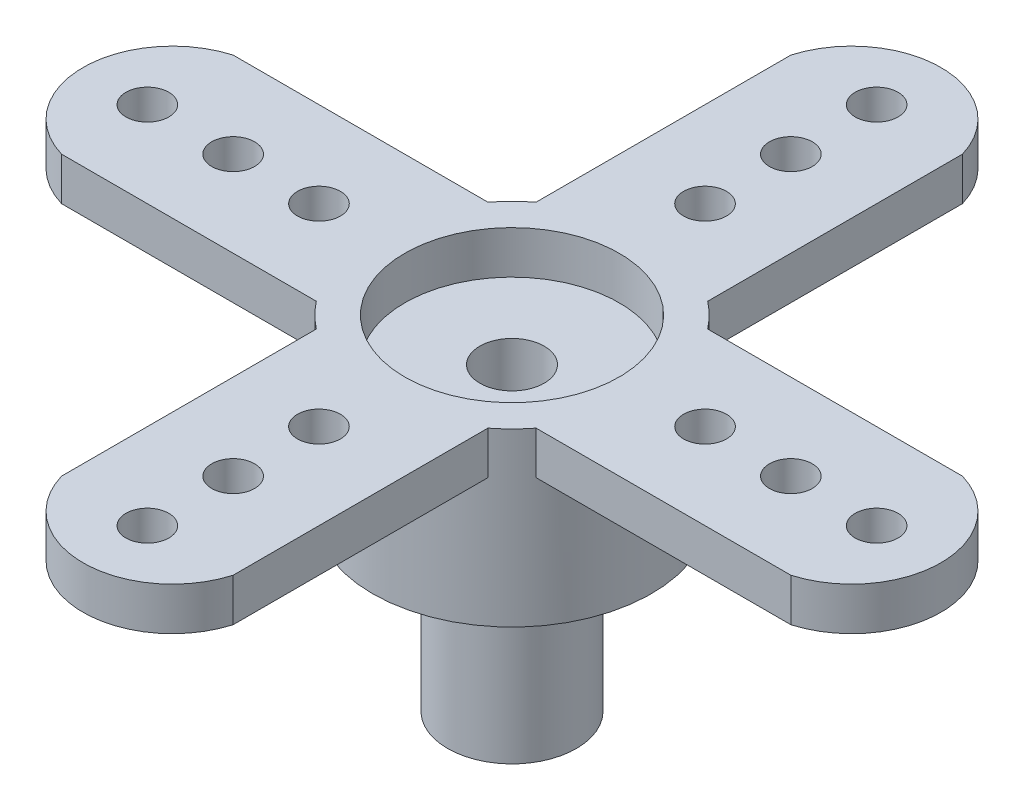
ISO-10303-21;
HEADER;
FILE_DESCRIPTION(('STEP AP214'),'2;1');
FILE_NAME('part.step','',(''),(''),'','','');
FILE_SCHEMA(('AUTOMOTIVE_DESIGN { 1 0 10303 214 1 1 1 1 }'));
ENDSEC;
DATA;
#1=APPLICATION_CONTEXT('core data for automotive mechanical design processes');
#2=APPLICATION_PROTOCOL_DEFINITION('international standard','automotive_design',2000,#1);
#3=PRODUCT_CONTEXT('',#1,'mechanical');
#4=PRODUCT('Part','Part','',(#3));
#5=PRODUCT_RELATED_PRODUCT_CATEGORY('part','',(#4));
#6=PRODUCT_DEFINITION_FORMATION('','',#4);
#7=PRODUCT_DEFINITION_CONTEXT('part definition',#1,'design');
#8=PRODUCT_DEFINITION('design','',#6,#7);
#9=PRODUCT_DEFINITION_SHAPE('','',#8);
#10=(LENGTH_UNIT() NAMED_UNIT(*) SI_UNIT(.MILLI.,.METRE.));
#11=(NAMED_UNIT(*) PLANE_ANGLE_UNIT() SI_UNIT($,.RADIAN.));
#12=(NAMED_UNIT(*) SI_UNIT($,.STERADIAN.) SOLID_ANGLE_UNIT());
#13=UNCERTAINTY_MEASURE_WITH_UNIT(LENGTH_MEASURE(1.E-05),#10,'distance_accuracy_value','');
#14=(GEOMETRIC_REPRESENTATION_CONTEXT(3) GLOBAL_UNCERTAINTY_ASSIGNED_CONTEXT((#13)) GLOBAL_UNIT_ASSIGNED_CONTEXT((#10,
#11,#12)) REPRESENTATION_CONTEXT('',''));
#15=CARTESIAN_POINT('',(0.,0.,0.));
#16=DIRECTION('',(0.,0.,1.));
#17=DIRECTION('',(1.,0.,0.));
#18=AXIS2_PLACEMENT_3D('',#15,#16,#17);
#19=CARTESIAN_POINT('',(0.,7.,4.5));
#20=DIRECTION('',(0.,1.,0.));
#21=DIRECTION('',(0.,0.,1.));
#22=AXIS2_PLACEMENT_3D('',#19,#20,#21);
#23=CYLINDRICAL_SURFACE('',#22,0.5);
#24=CARTESIAN_POINT('',(0.,7.,4.5));
#25=DIRECTION('',(0.,1.,0.));
#26=DIRECTION('',(0.,0.,1.));
#27=AXIS2_PLACEMENT_3D('',#24,#25,#26);
#28=CIRCLE('',#27,0.5);
#29=CARTESIAN_POINT('',(0.,7.,5.));
#30=VERTEX_POINT('',#29);
#31=EDGE_CURVE('E52',#30,#30,#28,.T.);
#32=ORIENTED_EDGE('',*,*,#31,.F.);
#33=EDGE_LOOP('',(#32));
#34=FACE_BOUND('',#33,.T.);
#35=CARTESIAN_POINT('',(0.,8.,4.5));
#36=DIRECTION('',(0.,1.,0.));
#37=DIRECTION('',(0.,0.,1.));
#38=AXIS2_PLACEMENT_3D('',#35,#36,#37);
#39=CIRCLE('',#38,0.5);
#40=CARTESIAN_POINT('',(0.,8.,5.));
#41=VERTEX_POINT('',#40);
#42=EDGE_CURVE('E11',#41,#41,#39,.T.);
#43=ORIENTED_EDGE('',*,*,#42,.T.);
#44=EDGE_LOOP('',(#43));
#45=FACE_BOUND('',#44,.T.);
#46=ADVANCED_FACE('F45',(#34,#45),#23,.F.);
#47=CARTESIAN_POINT('',(0.,8.,0.));
#48=DIRECTION('',(0.,-1.,0.));
#49=DIRECTION('',(0.,0.,-1.));
#50=AXIS2_PLACEMENT_3D('',#47,#48,#49);
#51=CYLINDRICAL_SURFACE('',#50,3.25);
#52=CARTESIAN_POINT('',(0.,4.,0.));
#53=DIRECTION('',(0.,1.,0.));
#54=DIRECTION('',(0.,0.,1.));
#55=AXIS2_PLACEMENT_3D('',#52,#53,#54);
#56=CIRCLE('',#55,3.25);
#57=CARTESIAN_POINT('',(0.,4.,3.25));
#58=VERTEX_POINT('',#57);
#59=EDGE_CURVE('E269',#58,#58,#56,.T.);
#60=ORIENTED_EDGE('',*,*,#59,.T.);
#61=EDGE_LOOP('',(#60));
#62=FACE_BOUND('',#61,.T.);
#63=DIRECTION('',(0.,1.,0.));
#64=VECTOR('',#63,1.);
#65=CARTESIAN_POINT('',(-2.56173769148992,7.,-1.99999999999997));
#66=LINE('',#65,#64);
#67=CARTESIAN_POINT('',(-2.56173769148992,7.,-1.99999999999997));
#68=VERTEX_POINT('',#67);
#69=CARTESIAN_POINT('',(-2.56173769148992,8.,-1.99999999999997));
#70=VERTEX_POINT('',#69);
#71=EDGE_CURVE('E194',#68,#70,#66,.T.);
#72=ORIENTED_EDGE('',*,*,#71,.T.);
#73=CARTESIAN_POINT('',(0.,8.,0.));
#74=DIRECTION('',(0.,1.,0.));
#75=DIRECTION('',(0.,0.,1.));
#76=AXIS2_PLACEMENT_3D('',#73,#74,#75);
#77=CIRCLE('',#76,3.25);
#78=CARTESIAN_POINT('',(-2.,8.,-2.5617376914899));
#79=VERTEX_POINT('',#78);
#80=EDGE_CURVE('E335',#79,#70,#77,.T.);
#81=ORIENTED_EDGE('',*,*,#80,.F.);
#82=DIRECTION('',(0.,1.,0.));
#83=VECTOR('',#82,1.);
#84=CARTESIAN_POINT('',(-2.,7.,-2.5617376914899));
#85=LINE('',#84,#83);
#86=CARTESIAN_POINT('',(-2.,7.,-2.5617376914899));
#87=VERTEX_POINT('',#86);
#88=EDGE_CURVE('E219',#87,#79,#85,.T.);
#89=ORIENTED_EDGE('',*,*,#88,.F.);
#90=CARTESIAN_POINT('',(0.,7.,0.));
#91=DIRECTION('',(0.,1.,0.));
#92=DIRECTION('',(0.,0.,-1.));
#93=AXIS2_PLACEMENT_3D('',#90,#91,#92);
#94=CIRCLE('',#93,3.25);
#95=CARTESIAN_POINT('',(2.,7.,-2.5617376914899));
#96=VERTEX_POINT('',#95);
#97=EDGE_CURVE('E205',#96,#87,#94,.T.);
#98=ORIENTED_EDGE('',*,*,#97,.F.);
#99=DIRECTION('',(0.,1.,0.));
#100=VECTOR('',#99,1.);
#101=CARTESIAN_POINT('',(2.,7.,-2.5617376914899));
#102=LINE('',#101,#100);
#103=CARTESIAN_POINT('',(2.,8.,-2.5617376914899));
#104=VERTEX_POINT('',#103);
#105=EDGE_CURVE('E216',#96,#104,#102,.T.);
#106=ORIENTED_EDGE('',*,*,#105,.T.);
#107=CARTESIAN_POINT('',(2.56173769148989,8.,-2.00000000000001));
#108=VERTEX_POINT('',#107);
#109=EDGE_CURVE('E281',#108,#104,#77,.T.);
#110=ORIENTED_EDGE('',*,*,#109,.F.);
#111=DIRECTION('',(0.,1.,0.));
#112=VECTOR('',#111,1.);
#113=CARTESIAN_POINT('',(2.56173769148989,7.,-2.00000000000001));
#114=LINE('',#113,#112);
#115=CARTESIAN_POINT('',(2.56173769148989,7.,-2.00000000000001));
#116=VERTEX_POINT('',#115);
#117=EDGE_CURVE('E245',#116,#108,#114,.T.);
#118=ORIENTED_EDGE('',*,*,#117,.F.);
#119=CARTESIAN_POINT('',(0.,7.,0.));
#120=DIRECTION('',(0.,1.,0.));
#121=DIRECTION('',(1.,0.,0.));
#122=AXIS2_PLACEMENT_3D('',#119,#120,#121);
#123=CIRCLE('',#122,3.25);
#124=CARTESIAN_POINT('',(2.56173769148991,7.,1.99999999999999));
#125=VERTEX_POINT('',#124);
#126=EDGE_CURVE('E229',#125,#116,#123,.T.);
#127=ORIENTED_EDGE('',*,*,#126,.F.);
#128=DIRECTION('',(0.,1.,0.));
#129=VECTOR('',#128,1.);
#130=CARTESIAN_POINT('',(2.56173769148991,7.,1.99999999999999));
#131=LINE('',#130,#129);
#132=CARTESIAN_POINT('',(2.56173769148991,8.,1.99999999999999));
#133=VERTEX_POINT('',#132);
#134=EDGE_CURVE('E242',#125,#133,#131,.T.);
#135=ORIENTED_EDGE('',*,*,#134,.T.);
#136=CARTESIAN_POINT('',(2.,8.,2.5617376914899));
#137=VERTEX_POINT('',#136);
#138=EDGE_CURVE('E277',#137,#133,#77,.T.);
#139=ORIENTED_EDGE('',*,*,#138,.F.);
#140=DIRECTION('',(0.,1.,0.));
#141=VECTOR('',#140,1.);
#142=CARTESIAN_POINT('',(2.,7.,2.5617376914899));
#143=LINE('',#142,#141);
#144=CARTESIAN_POINT('',(2.,7.,2.5617376914899));
#145=VERTEX_POINT('',#144);
#146=EDGE_CURVE('E273',#145,#137,#143,.T.);
#147=ORIENTED_EDGE('',*,*,#146,.F.);
#148=CARTESIAN_POINT('',(0.,7.,0.));
#149=DIRECTION('',(0.,1.,0.));
#150=DIRECTION('',(0.,0.,1.));
#151=AXIS2_PLACEMENT_3D('',#148,#149,#150);
#152=CIRCLE('',#151,3.25);
#153=CARTESIAN_POINT('',(-2.,7.,2.5617376914899));
#154=VERTEX_POINT('',#153);
#155=EDGE_CURVE('E256',#154,#145,#152,.T.);
#156=ORIENTED_EDGE('',*,*,#155,.F.);
#157=DIRECTION('',(0.,1.,0.));
#158=VECTOR('',#157,1.);
#159=CARTESIAN_POINT('',(-2.,7.,2.5617376914899));
#160=LINE('',#159,#158);
#161=CARTESIAN_POINT('',(-2.,8.,2.5617376914899));
#162=VERTEX_POINT('',#161);
#163=EDGE_CURVE('E270',#154,#162,#160,.T.);
#164=ORIENTED_EDGE('',*,*,#163,.T.);
#165=CARTESIAN_POINT('',(-2.56173769148988,8.,2.00000000000003));
#166=VERTEX_POINT('',#165);
#167=EDGE_CURVE('E282',#166,#162,#77,.T.);
#168=ORIENTED_EDGE('',*,*,#167,.F.);
#169=DIRECTION('',(0.,1.,0.));
#170=VECTOR('',#169,1.);
#171=CARTESIAN_POINT('',(-2.56173769148988,7.,2.00000000000003));
#172=LINE('',#171,#170);
#173=CARTESIAN_POINT('',(-2.56173769148988,7.,2.00000000000003));
#174=VERTEX_POINT('',#173);
#175=EDGE_CURVE('E166',#174,#166,#172,.T.);
#176=ORIENTED_EDGE('',*,*,#175,.F.);
#177=CARTESIAN_POINT('',(0.,7.,0.));
#178=DIRECTION('',(0.,1.,0.));
#179=DIRECTION('',(-1.,0.,0.));
#180=AXIS2_PLACEMENT_3D('',#177,#178,#179);
#181=CIRCLE('',#180,3.25);
#182=EDGE_CURVE('E174',#68,#174,#181,.T.);
#183=ORIENTED_EDGE('',*,*,#182,.F.);
#184=EDGE_LOOP('',(#72,#81,#89,#98,#106,#110,#118,#127,#135,#139,#147,#156,#164,#168,#176,#183));
#185=FACE_BOUND('',#184,.T.);
#186=ADVANCED_FACE('F296',(#62,#185),#51,.T.);
#187=CARTESIAN_POINT('',(0.,4.,0.));
#188=DIRECTION('',(0.,-1.,0.));
#189=DIRECTION('',(0.,0.,-1.));
#190=AXIS2_PLACEMENT_3D('',#187,#188,#189);
#191=CYLINDRICAL_SURFACE('',#190,1.5);
#192=CARTESIAN_POINT('',(0.,4.,0.));
#193=DIRECTION('',(0.,1.,0.));
#194=DIRECTION('',(0.,0.,1.));
#195=AXIS2_PLACEMENT_3D('',#192,#193,#194);
#196=CIRCLE('',#195,1.5);
#197=CARTESIAN_POINT('',(0.,4.,1.5));
#198=VERTEX_POINT('',#197);
#199=EDGE_CURVE('E285',#198,#198,#196,.T.);
#200=ORIENTED_EDGE('',*,*,#199,.F.);
#201=EDGE_LOOP('',(#200));
#202=FACE_BOUND('',#201,.T.);
#203=CARTESIAN_POINT('',(0.,0.,0.));
#204=DIRECTION('',(0.,1.,0.));
#205=DIRECTION('',(0.,0.,1.));
#206=AXIS2_PLACEMENT_3D('',#203,#204,#205);
#207=CIRCLE('',#206,1.5);
#208=CARTESIAN_POINT('',(0.,0.,1.5));
#209=VERTEX_POINT('',#208);
#210=EDGE_CURVE('E280',#209,#209,#207,.T.);
#211=ORIENTED_EDGE('',*,*,#210,.T.);
#212=EDGE_LOOP('',(#211));
#213=FACE_BOUND('',#212,.T.);
#214=ADVANCED_FACE('F312',(#202,#213),#191,.T.);
#215=CARTESIAN_POINT('',(0.,0.,0.));
#216=DIRECTION('',(0.,1.,0.));
#217=DIRECTION('',(0.,0.,1.));
#218=AXIS2_PLACEMENT_3D('',#215,#216,#217);
#219=PLANE('',#218);
#220=ORIENTED_EDGE('',*,*,#210,.F.);
#221=EDGE_LOOP('',(#220));
#222=FACE_BOUND('',#221,.T.);
#223=ADVANCED_FACE('F302',(#222),#219,.F.);
#224=CARTESIAN_POINT('',(0.,8.,0.));
#225=DIRECTION('',(0.,1.,0.));
#226=DIRECTION('',(0.,0.,1.));
#227=AXIS2_PLACEMENT_3D('',#224,#225,#226);
#228=PLANE('',#227);
#229=CARTESIAN_POINT('',(0.,8.,0.));
#230=DIRECTION('',(0.,1.,0.));
#231=DIRECTION('',(0.,0.,1.));
#232=AXIS2_PLACEMENT_3D('',#229,#230,#231);
#233=CIRCLE('',#232,2.5);
#234=CARTESIAN_POINT('',(0.,8.,2.5));
#235=VERTEX_POINT('',#234);
#236=EDGE_CURVE('E715',#235,#235,#233,.T.);
#237=ORIENTED_EDGE('',*,*,#236,.F.);
#238=EDGE_LOOP('',(#237));
#239=FACE_BOUND('',#238,.T.);
#240=CARTESIAN_POINT('',(-6.5,8.,0.));
#241=DIRECTION('',(0.,1.,0.));
#242=DIRECTION('',(-1.,0.,0.));
#243=AXIS2_PLACEMENT_3D('',#240,#241,#242);
#244=CIRCLE('',#243,0.5);
#245=CARTESIAN_POINT('',(-7.,8.,0.));
#246=VERTEX_POINT('',#245);
#247=EDGE_CURVE('E711',#246,#246,#244,.T.);
#248=ORIENTED_EDGE('',*,*,#247,.F.);
#249=EDGE_LOOP('',(#248));
#250=FACE_BOUND('',#249,.T.);
#251=CARTESIAN_POINT('',(-4.5,8.,0.));
#252=DIRECTION('',(0.,1.,0.));
#253=DIRECTION('',(-1.,0.,0.));
#254=AXIS2_PLACEMENT_3D('',#251,#252,#253);
#255=CIRCLE('',#254,0.5);
#256=CARTESIAN_POINT('',(-5.,8.,0.));
#257=VERTEX_POINT('',#256);
#258=EDGE_CURVE('E706',#257,#257,#255,.T.);
#259=ORIENTED_EDGE('',*,*,#258,.F.);
#260=EDGE_LOOP('',(#259));
#261=FACE_BOUND('',#260,.T.);
#262=CARTESIAN_POINT('',(0.,8.,-6.5));
#263=DIRECTION('',(0.,1.,0.));
#264=DIRECTION('',(0.,0.,-1.));
#265=AXIS2_PLACEMENT_3D('',#262,#263,#264);
#266=CIRCLE('',#265,0.5);
#267=CARTESIAN_POINT('',(0.,8.,-7.));
#268=VERTEX_POINT('',#267);
#269=EDGE_CURVE('E702',#268,#268,#266,.T.);
#270=ORIENTED_EDGE('',*,*,#269,.F.);
#271=EDGE_LOOP('',(#270));
#272=FACE_BOUND('',#271,.T.);
#273=CARTESIAN_POINT('',(0.,8.,-4.5));
#274=DIRECTION('',(0.,1.,0.));
#275=DIRECTION('',(0.,0.,-1.));
#276=AXIS2_PLACEMENT_3D('',#273,#274,#275);
#277=CIRCLE('',#276,0.5);
#278=CARTESIAN_POINT('',(0.,8.,-5.));
#279=VERTEX_POINT('',#278);
#280=EDGE_CURVE('E696',#279,#279,#277,.T.);
#281=ORIENTED_EDGE('',*,*,#280,.F.);
#282=EDGE_LOOP('',(#281));
#283=FACE_BOUND('',#282,.T.);
#284=CARTESIAN_POINT('',(6.5,8.,0.));
#285=DIRECTION('',(0.,1.,0.));
#286=DIRECTION('',(1.,0.,0.));
#287=AXIS2_PLACEMENT_3D('',#284,#285,#286);
#288=CIRCLE('',#287,0.5);
#289=CARTESIAN_POINT('',(7.,8.,0.));
#290=VERTEX_POINT('',#289);
#291=EDGE_CURVE('E691',#290,#290,#288,.T.);
#292=ORIENTED_EDGE('',*,*,#291,.F.);
#293=EDGE_LOOP('',(#292));
#294=FACE_BOUND('',#293,.T.);
#295=CARTESIAN_POINT('',(4.5,8.,0.));
#296=DIRECTION('',(0.,1.,0.));
#297=DIRECTION('',(1.,0.,0.));
#298=AXIS2_PLACEMENT_3D('',#295,#296,#297);
#299=CIRCLE('',#298,0.5);
#300=CARTESIAN_POINT('',(5.,8.,0.));
#301=VERTEX_POINT('',#300);
#302=EDGE_CURVE('E675',#301,#301,#299,.T.);
#303=ORIENTED_EDGE('',*,*,#302,.F.);
#304=EDGE_LOOP('',(#303));
#305=FACE_BOUND('',#304,.T.);
#306=CARTESIAN_POINT('',(8.5,8.,0.));
#307=DIRECTION('',(0.,1.,0.));
#308=DIRECTION('',(1.,0.,0.));
#309=AXIS2_PLACEMENT_3D('',#306,#307,#308);
#310=CIRCLE('',#309,0.5);
#311=CARTESIAN_POINT('',(9.,8.,0.));
#312=VERTEX_POINT('',#311);
#313=EDGE_CURVE('E668',#312,#312,#310,.T.);
#314=ORIENTED_EDGE('',*,*,#313,.F.);
#315=EDGE_LOOP('',(#314));
#316=FACE_BOUND('',#315,.T.);
#317=CARTESIAN_POINT('',(0.,8.,-8.5));
#318=DIRECTION('',(0.,1.,0.));
#319=DIRECTION('',(0.,0.,-1.));
#320=AXIS2_PLACEMENT_3D('',#317,#318,#319);
#321=CIRCLE('',#320,0.5);
#322=CARTESIAN_POINT('',(0.,8.,-9.));
#323=VERTEX_POINT('',#322);
#324=EDGE_CURVE('E639',#323,#323,#321,.T.);
#325=ORIENTED_EDGE('',*,*,#324,.F.);
#326=EDGE_LOOP('',(#325));
#327=FACE_BOUND('',#326,.T.);
#328=CARTESIAN_POINT('',(-8.5,8.,0.));
#329=DIRECTION('',(0.,1.,0.));
#330=DIRECTION('',(-1.,0.,0.));
#331=AXIS2_PLACEMENT_3D('',#328,#329,#330);
#332=CIRCLE('',#331,0.5);
#333=CARTESIAN_POINT('',(-9.,8.,0.));
#334=VERTEX_POINT('',#333);
#335=EDGE_CURVE('E640',#334,#334,#332,.T.);
#336=ORIENTED_EDGE('',*,*,#335,.F.);
#337=EDGE_LOOP('',(#336));
#338=FACE_BOUND('',#337,.T.);
#339=CARTESIAN_POINT('',(0.,8.,6.5));
#340=DIRECTION('',(0.,1.,0.));
#341=DIRECTION('',(0.,0.,1.));
#342=AXIS2_PLACEMENT_3D('',#339,#340,#341);
#343=CIRCLE('',#342,0.5);
#344=CARTESIAN_POINT('',(0.,8.,7.));
#345=VERTEX_POINT('',#344);
#346=EDGE_CURVE('E653',#345,#345,#343,.T.);
#347=ORIENTED_EDGE('',*,*,#346,.F.);
#348=EDGE_LOOP('',(#347));
#349=FACE_BOUND('',#348,.T.);
#350=CARTESIAN_POINT('',(0.,8.,8.5));
#351=DIRECTION('',(0.,1.,0.));
#352=DIRECTION('',(0.,0.,1.));
#353=AXIS2_PLACEMENT_3D('',#350,#351,#352);
#354=CIRCLE('',#353,0.5);
#355=CARTESIAN_POINT('',(0.,8.,9.));
#356=VERTEX_POINT('',#355);
#357=EDGE_CURVE('E183',#356,#356,#354,.T.);
#358=ORIENTED_EDGE('',*,*,#357,.F.);
#359=EDGE_LOOP('',(#358));
#360=FACE_BOUND('',#359,.T.);
#361=ORIENTED_EDGE('',*,*,#138,.T.);
#362=DIRECTION('',(-1.,0.,0.));
#363=VECTOR('',#362,1.);
#364=CARTESIAN_POINT('',(0.,8.,2.));
#365=LINE('',#364,#363);
#366=CARTESIAN_POINT('',(8.50000000000001,8.,1.99999999999997));
#367=VERTEX_POINT('',#366);
#368=EDGE_CURVE('E226',#367,#133,#365,.T.);
#369=ORIENTED_EDGE('',*,*,#368,.F.);
#370=CARTESIAN_POINT('',(7.91666666666666,8.,0.));
#371=DIRECTION('',(0.,1.,0.));
#372=DIRECTION('',(1.,0.,0.));
#373=AXIS2_PLACEMENT_3D('',#370,#371,#372);
#374=CIRCLE('',#373,2.08333333333333);
#375=CARTESIAN_POINT('',(8.49999999999999,8.,-2.00000000000003));
#376=VERTEX_POINT('',#375);
#377=EDGE_CURVE('E215',#367,#376,#374,.T.);
#378=ORIENTED_EDGE('',*,*,#377,.T.);
#379=DIRECTION('',(-1.,0.,0.));
#380=VECTOR('',#379,1.);
#381=CARTESIAN_POINT('',(0.,8.,-2.));
#382=LINE('',#381,#380);
#383=EDGE_CURVE('E236',#376,#108,#382,.T.);
#384=ORIENTED_EDGE('',*,*,#383,.T.);
#385=ORIENTED_EDGE('',*,*,#109,.T.);
#386=DIRECTION('',(0.,0.,1.));
#387=VECTOR('',#386,1.);
#388=CARTESIAN_POINT('',(2.,8.,0.));
#389=LINE('',#388,#387);
#390=CARTESIAN_POINT('',(2.,8.,-8.5));
#391=VERTEX_POINT('',#390);
#392=EDGE_CURVE('E202',#391,#104,#389,.T.);
#393=ORIENTED_EDGE('',*,*,#392,.F.);
#394=CARTESIAN_POINT('',(0.,8.,-7.91666666666666));
#395=DIRECTION('',(0.,1.,0.));
#396=DIRECTION('',(0.,0.,-1.));
#397=AXIS2_PLACEMENT_3D('',#394,#395,#396);
#398=CIRCLE('',#397,2.08333333333333);
#399=CARTESIAN_POINT('',(-2.,8.,-8.5));
#400=VERTEX_POINT('',#399);
#401=EDGE_CURVE('E193',#391,#400,#398,.T.);
#402=ORIENTED_EDGE('',*,*,#401,.T.);
#403=DIRECTION('',(0.,0.,1.));
#404=VECTOR('',#403,1.);
#405=CARTESIAN_POINT('',(-2.,8.,0.));
#406=LINE('',#405,#404);
#407=EDGE_CURVE('E66',#400,#79,#406,.T.);
#408=ORIENTED_EDGE('',*,*,#407,.T.);
#409=ORIENTED_EDGE('',*,*,#80,.T.);
#410=DIRECTION('',(1.,0.,0.));
#411=VECTOR('',#410,1.);
#412=CARTESIAN_POINT('',(0.,8.,-2.));
#413=LINE('',#412,#411);
#414=CARTESIAN_POINT('',(-8.50000000000002,8.,-1.99999999999991));
#415=VERTEX_POINT('',#414);
#416=EDGE_CURVE('E179',#415,#70,#413,.T.);
#417=ORIENTED_EDGE('',*,*,#416,.F.);
#418=CARTESIAN_POINT('',(-7.91666666666666,8.,0.));
#419=DIRECTION('',(0.,1.,0.));
#420=DIRECTION('',(-1.,0.,0.));
#421=AXIS2_PLACEMENT_3D('',#418,#419,#420);
#422=CIRCLE('',#421,2.08333333333333);
#423=CARTESIAN_POINT('',(-8.49999999999998,8.,2.00000000000009));
#424=VERTEX_POINT('',#423);
#425=EDGE_CURVE('E188',#415,#424,#422,.T.);
#426=ORIENTED_EDGE('',*,*,#425,.T.);
#427=DIRECTION('',(1.,0.,0.));
#428=VECTOR('',#427,1.);
#429=CARTESIAN_POINT('',(0.,8.,2.));
#430=LINE('',#429,#428);
#431=EDGE_CURVE('E59',#424,#166,#430,.T.);
#432=ORIENTED_EDGE('',*,*,#431,.T.);
#433=ORIENTED_EDGE('',*,*,#167,.T.);
#434=DIRECTION('',(0.,0.,-1.));
#435=VECTOR('',#434,1.);
#436=CARTESIAN_POINT('',(-2.,8.,0.));
#437=LINE('',#436,#435);
#438=CARTESIAN_POINT('',(-2.,8.,8.5));
#439=VERTEX_POINT('',#438);
#440=EDGE_CURVE('E253',#439,#162,#437,.T.);
#441=ORIENTED_EDGE('',*,*,#440,.F.);
#442=CARTESIAN_POINT('',(0.,8.,7.91666666666666));
#443=DIRECTION('',(0.,1.,0.));
#444=DIRECTION('',(0.,0.,1.));
#445=AXIS2_PLACEMENT_3D('',#442,#443,#444);
#446=CIRCLE('',#445,2.08333333333333);
#447=CARTESIAN_POINT('',(2.,8.,8.5));
#448=VERTEX_POINT('',#447);
#449=EDGE_CURVE('E241',#439,#448,#446,.T.);
#450=ORIENTED_EDGE('',*,*,#449,.T.);
#451=DIRECTION('',(0.,0.,-1.));
#452=VECTOR('',#451,1.);
#453=CARTESIAN_POINT('',(2.,8.,0.));
#454=LINE('',#453,#452);
#455=EDGE_CURVE('E263',#448,#137,#454,.T.);
#456=ORIENTED_EDGE('',*,*,#455,.T.);
#457=EDGE_LOOP('',(#361,#369,#378,#384,#385,#393,#402,#408,#409,#417,#426,#432,#433,#441,#450,#456));
#458=FACE_BOUND('',#457,.T.);
#459=ORIENTED_EDGE('',*,*,#42,.F.);
#460=EDGE_LOOP('',(#459));
#461=FACE_BOUND('',#460,.T.);
#462=ADVANCED_FACE('F299',(#239,#250,#261,#272,#283,#294,#305,#316,#327,#338,#349,#360,#458,
#461),#228,.T.);
#463=CARTESIAN_POINT('',(0.,4.,0.));
#464=DIRECTION('',(0.,1.,0.));
#465=DIRECTION('',(0.,0.,1.));
#466=AXIS2_PLACEMENT_3D('',#463,#464,#465);
#467=PLANE('',#466);
#468=ORIENTED_EDGE('',*,*,#199,.T.);
#469=EDGE_LOOP('',(#468));
#470=FACE_BOUND('',#469,.T.);
#471=ORIENTED_EDGE('',*,*,#59,.F.);
#472=EDGE_LOOP('',(#471));
#473=FACE_BOUND('',#472,.T.);
#474=ADVANCED_FACE('F301',(#470,#473),#467,.F.);
#475=CARTESIAN_POINT('',(0.,7.,7.91666666666666));
#476=DIRECTION('',(0.,1.,0.));
#477=DIRECTION('',(0.,0.,1.));
#478=AXIS2_PLACEMENT_3D('',#475,#476,#477);
#479=CYLINDRICAL_SURFACE('',#478,2.08333333333333);
#480=ORIENTED_EDGE('',*,*,#449,.F.);
#481=DIRECTION('',(0.,1.,0.));
#482=VECTOR('',#481,1.);
#483=CARTESIAN_POINT('',(-2.,7.,8.5));
#484=LINE('',#483,#482);
#485=CARTESIAN_POINT('',(-2.,7.,8.5));
#486=VERTEX_POINT('',#485);
#487=EDGE_CURVE('E267',#486,#439,#484,.T.);
#488=ORIENTED_EDGE('',*,*,#487,.F.);
#489=CARTESIAN_POINT('',(0.,7.,7.91666666666666));
#490=DIRECTION('',(0.,1.,0.));
#491=DIRECTION('',(0.,0.,1.));
#492=AXIS2_PLACEMENT_3D('',#489,#490,#491);
#493=CIRCLE('',#492,2.08333333333333);
#494=CARTESIAN_POINT('',(2.,7.,8.5));
#495=VERTEX_POINT('',#494);
#496=EDGE_CURVE('E249',#486,#495,#493,.T.);
#497=ORIENTED_EDGE('',*,*,#496,.T.);
#498=DIRECTION('',(0.,1.,0.));
#499=VECTOR('',#498,1.);
#500=CARTESIAN_POINT('',(2.,7.,8.5));
#501=LINE('',#500,#499);
#502=EDGE_CURVE('E260',#495,#448,#501,.T.);
#503=ORIENTED_EDGE('',*,*,#502,.T.);
#504=EDGE_LOOP('',(#480,#488,#497,#503));
#505=FACE_BOUND('',#504,.T.);
#506=ADVANCED_FACE('F309',(#505),#479,.T.);
#507=CARTESIAN_POINT('',(-2.,7.,0.));
#508=DIRECTION('',(1.,0.,0.));
#509=DIRECTION('',(0.,0.,-1.));
#510=AXIS2_PLACEMENT_3D('',#507,#508,#509);
#511=PLANE('',#510);
#512=ORIENTED_EDGE('',*,*,#440,.T.);
#513=ORIENTED_EDGE('',*,*,#163,.F.);
#514=DIRECTION('',(0.,0.,-1.));
#515=VECTOR('',#514,1.);
#516=CARTESIAN_POINT('',(-2.,7.,0.));
#517=LINE('',#516,#515);
#518=EDGE_CURVE('E258',#486,#154,#517,.T.);
#519=ORIENTED_EDGE('',*,*,#518,.F.);
#520=ORIENTED_EDGE('',*,*,#487,.T.);
#521=EDGE_LOOP('',(#512,#513,#519,#520));
#522=FACE_BOUND('',#521,.T.);
#523=ADVANCED_FACE('F344',(#522),#511,.F.);
#524=CARTESIAN_POINT('',(2.,7.,0.));
#525=DIRECTION('',(1.,0.,0.));
#526=DIRECTION('',(0.,0.,-1.));
#527=AXIS2_PLACEMENT_3D('',#524,#525,#526);
#528=PLANE('',#527);
#529=ORIENTED_EDGE('',*,*,#455,.F.);
#530=ORIENTED_EDGE('',*,*,#502,.F.);
#531=DIRECTION('',(0.,0.,-1.));
#532=VECTOR('',#531,1.);
#533=CARTESIAN_POINT('',(2.,7.,0.));
#534=LINE('',#533,#532);
#535=EDGE_CURVE('E252',#495,#145,#534,.T.);
#536=ORIENTED_EDGE('',*,*,#535,.T.);
#537=ORIENTED_EDGE('',*,*,#146,.T.);
#538=EDGE_LOOP('',(#529,#530,#536,#537));
#539=FACE_BOUND('',#538,.T.);
#540=ADVANCED_FACE('F354',(#539),#528,.T.);
#541=CARTESIAN_POINT('',(0.,7.,0.));
#542=DIRECTION('',(0.,1.,0.));
#543=DIRECTION('',(0.,0.,1.));
#544=AXIS2_PLACEMENT_3D('',#541,#542,#543);
#545=PLANE('',#544);
#546=CARTESIAN_POINT('',(0.,7.,6.5));
#547=DIRECTION('',(0.,1.,0.));
#548=DIRECTION('',(0.,0.,1.));
#549=AXIS2_PLACEMENT_3D('',#546,#547,#548);
#550=CIRCLE('',#549,0.5);
#551=CARTESIAN_POINT('',(0.,7.,7.));
#552=VERTEX_POINT('',#551);
#553=EDGE_CURVE('E650',#552,#552,#550,.T.);
#554=ORIENTED_EDGE('',*,*,#553,.T.);
#555=EDGE_LOOP('',(#554));
#556=FACE_BOUND('',#555,.T.);
#557=CARTESIAN_POINT('',(0.,7.,8.5));
#558=DIRECTION('',(0.,1.,0.));
#559=DIRECTION('',(0.,0.,1.));
#560=AXIS2_PLACEMENT_3D('',#557,#558,#559);
#561=CIRCLE('',#560,0.5);
#562=CARTESIAN_POINT('',(0.,7.,9.));
#563=VERTEX_POINT('',#562);
#564=EDGE_CURVE('E190',#563,#563,#561,.T.);
#565=ORIENTED_EDGE('',*,*,#564,.T.);
#566=EDGE_LOOP('',(#565));
#567=FACE_BOUND('',#566,.T.);
#568=ORIENTED_EDGE('',*,*,#496,.F.);
#569=ORIENTED_EDGE('',*,*,#518,.T.);
#570=ORIENTED_EDGE('',*,*,#155,.T.);
#571=ORIENTED_EDGE('',*,*,#535,.F.);
#572=EDGE_LOOP('',(#568,#569,#570,#571));
#573=FACE_BOUND('',#572,.T.);
#574=ORIENTED_EDGE('',*,*,#31,.T.);
#575=EDGE_LOOP('',(#574));
#576=FACE_BOUND('',#575,.T.);
#577=ADVANCED_FACE('F292',(#556,#567,#573,#576),#545,.F.);
#578=CARTESIAN_POINT('',(7.91666666666666,7.,0.));
#579=DIRECTION('',(0.,1.,0.));
#580=DIRECTION('',(0.,0.,1.));
#581=AXIS2_PLACEMENT_3D('',#578,#579,#580);
#582=CYLINDRICAL_SURFACE('',#581,2.08333333333333);
#583=ORIENTED_EDGE('',*,*,#377,.F.);
#584=DIRECTION('',(0.,1.,0.));
#585=VECTOR('',#584,1.);
#586=CARTESIAN_POINT('',(8.50000000000001,7.,1.99999999999997));
#587=LINE('',#586,#585);
#588=CARTESIAN_POINT('',(8.50000000000001,7.,1.99999999999997));
#589=VERTEX_POINT('',#588);
#590=EDGE_CURVE('E239',#589,#367,#587,.T.);
#591=ORIENTED_EDGE('',*,*,#590,.F.);
#592=CARTESIAN_POINT('',(7.91666666666666,7.,0.));
#593=DIRECTION('',(0.,1.,0.));
#594=DIRECTION('',(1.,0.,0.));
#595=AXIS2_PLACEMENT_3D('',#592,#593,#594);
#596=CIRCLE('',#595,2.08333333333333);
#597=CARTESIAN_POINT('',(8.49999999999999,7.,-2.00000000000003));
#598=VERTEX_POINT('',#597);
#599=EDGE_CURVE('E222',#589,#598,#596,.T.);
#600=ORIENTED_EDGE('',*,*,#599,.T.);
#601=DIRECTION('',(0.,1.,0.));
#602=VECTOR('',#601,1.);
#603=CARTESIAN_POINT('',(8.49999999999999,7.,-2.00000000000003));
#604=LINE('',#603,#602);
#605=EDGE_CURVE('E233',#598,#376,#604,.T.);
#606=ORIENTED_EDGE('',*,*,#605,.T.);
#607=EDGE_LOOP('',(#583,#591,#600,#606));
#608=FACE_BOUND('',#607,.T.);
#609=ADVANCED_FACE('F366',(#608),#582,.T.);
#610=CARTESIAN_POINT('',(0.,7.,2.));
#611=DIRECTION('',(0.,0.,-1.));
#612=DIRECTION('',(-1.,0.,0.));
#613=AXIS2_PLACEMENT_3D('',#610,#611,#612);
#614=PLANE('',#613);
#615=ORIENTED_EDGE('',*,*,#368,.T.);
#616=ORIENTED_EDGE('',*,*,#134,.F.);
#617=DIRECTION('',(-1.,0.,0.));
#618=VECTOR('',#617,1.);
#619=CARTESIAN_POINT('',(0.,7.,2.));
#620=LINE('',#619,#618);
#621=EDGE_CURVE('E231',#589,#125,#620,.T.);
#622=ORIENTED_EDGE('',*,*,#621,.F.);
#623=ORIENTED_EDGE('',*,*,#590,.T.);
#624=EDGE_LOOP('',(#615,#616,#622,#623));
#625=FACE_BOUND('',#624,.T.);
#626=ADVANCED_FACE('F363',(#625),#614,.F.);
#627=CARTESIAN_POINT('',(0.,7.,-2.));
#628=DIRECTION('',(0.,0.,-1.));
#629=DIRECTION('',(-1.,0.,0.));
#630=AXIS2_PLACEMENT_3D('',#627,#628,#629);
#631=PLANE('',#630);
#632=ORIENTED_EDGE('',*,*,#383,.F.);
#633=ORIENTED_EDGE('',*,*,#605,.F.);
#634=DIRECTION('',(-1.,0.,0.));
#635=VECTOR('',#634,1.);
#636=CARTESIAN_POINT('',(0.,7.,-2.));
#637=LINE('',#636,#635);
#638=EDGE_CURVE('E225',#598,#116,#637,.T.);
#639=ORIENTED_EDGE('',*,*,#638,.T.);
#640=ORIENTED_EDGE('',*,*,#117,.T.);
#641=EDGE_LOOP('',(#632,#633,#639,#640));
#642=FACE_BOUND('',#641,.T.);
#643=ADVANCED_FACE('F371',(#642),#631,.T.);
#644=CARTESIAN_POINT('',(0.,7.,0.));
#645=DIRECTION('',(0.,1.,0.));
#646=DIRECTION('',(1.,0.,0.));
#647=AXIS2_PLACEMENT_3D('',#644,#645,#646);
#648=PLANE('',#647);
#649=CARTESIAN_POINT('',(6.5,7.,0.));
#650=DIRECTION('',(0.,1.,0.));
#651=DIRECTION('',(1.,0.,0.));
#652=AXIS2_PLACEMENT_3D('',#649,#650,#651);
#653=CIRCLE('',#652,0.5);
#654=CARTESIAN_POINT('',(7.,7.,0.));
#655=VERTEX_POINT('',#654);
#656=EDGE_CURVE('E646',#655,#655,#653,.T.);
#657=ORIENTED_EDGE('',*,*,#656,.T.);
#658=EDGE_LOOP('',(#657));
#659=FACE_BOUND('',#658,.T.);
#660=CARTESIAN_POINT('',(4.5,7.,0.));
#661=DIRECTION('',(0.,1.,0.));
#662=DIRECTION('',(1.,0.,0.));
#663=AXIS2_PLACEMENT_3D('',#660,#661,#662);
#664=CIRCLE('',#663,0.5);
#665=CARTESIAN_POINT('',(5.,7.,0.));
#666=VERTEX_POINT('',#665);
#667=EDGE_CURVE('E687',#666,#666,#664,.T.);
#668=ORIENTED_EDGE('',*,*,#667,.T.);
#669=EDGE_LOOP('',(#668));
#670=FACE_BOUND('',#669,.T.);
#671=CARTESIAN_POINT('',(8.5,7.,0.));
#672=DIRECTION('',(0.,1.,0.));
#673=DIRECTION('',(1.,0.,0.));
#674=AXIS2_PLACEMENT_3D('',#671,#672,#673);
#675=CIRCLE('',#674,0.5);
#676=CARTESIAN_POINT('',(9.,7.,0.));
#677=VERTEX_POINT('',#676);
#678=EDGE_CURVE('E654',#677,#677,#675,.T.);
#679=ORIENTED_EDGE('',*,*,#678,.T.);
#680=EDGE_LOOP('',(#679));
#681=FACE_BOUND('',#680,.T.);
#682=ORIENTED_EDGE('',*,*,#599,.F.);
#683=ORIENTED_EDGE('',*,*,#621,.T.);
#684=ORIENTED_EDGE('',*,*,#126,.T.);
#685=ORIENTED_EDGE('',*,*,#638,.F.);
#686=EDGE_LOOP('',(#682,#683,#684,#685));
#687=FACE_BOUND('',#686,.T.);
#688=ADVANCED_FACE('F405',(#659,#670,#681,#687),#648,.F.);
#689=CARTESIAN_POINT('',(0.,7.,-7.91666666666666));
#690=DIRECTION('',(0.,1.,0.));
#691=DIRECTION('',(0.,0.,1.));
#692=AXIS2_PLACEMENT_3D('',#689,#690,#691);
#693=CYLINDRICAL_SURFACE('',#692,2.08333333333333);
#694=ORIENTED_EDGE('',*,*,#401,.F.);
#695=DIRECTION('',(0.,1.,0.));
#696=VECTOR('',#695,1.);
#697=CARTESIAN_POINT('',(2.,7.,-8.5));
#698=LINE('',#697,#696);
#699=CARTESIAN_POINT('',(2.,7.,-8.5));
#700=VERTEX_POINT('',#699);
#701=EDGE_CURVE('E213',#700,#391,#698,.T.);
#702=ORIENTED_EDGE('',*,*,#701,.F.);
#703=CARTESIAN_POINT('',(0.,7.,-7.91666666666666));
#704=DIRECTION('',(0.,1.,0.));
#705=DIRECTION('',(0.,0.,-1.));
#706=AXIS2_PLACEMENT_3D('',#703,#704,#705);
#707=CIRCLE('',#706,2.08333333333333);
#708=CARTESIAN_POINT('',(-2.,7.,-8.5));
#709=VERTEX_POINT('',#708);
#710=EDGE_CURVE('E198',#700,#709,#707,.T.);
#711=ORIENTED_EDGE('',*,*,#710,.T.);
#712=DIRECTION('',(0.,1.,0.));
#713=VECTOR('',#712,1.);
#714=CARTESIAN_POINT('',(-2.,7.,-8.5));
#715=LINE('',#714,#713);
#716=EDGE_CURVE('E209',#709,#400,#715,.T.);
#717=ORIENTED_EDGE('',*,*,#716,.T.);
#718=EDGE_LOOP('',(#694,#702,#711,#717));
#719=FACE_BOUND('',#718,.T.);
#720=ADVANCED_FACE('F381',(#719),#693,.T.);
#721=CARTESIAN_POINT('',(2.,7.,0.));
#722=DIRECTION('',(-1.,0.,0.));
#723=DIRECTION('',(0.,0.,1.));
#724=AXIS2_PLACEMENT_3D('',#721,#722,#723);
#725=PLANE('',#724);
#726=ORIENTED_EDGE('',*,*,#392,.T.);
#727=ORIENTED_EDGE('',*,*,#105,.F.);
#728=DIRECTION('',(0.,0.,1.));
#729=VECTOR('',#728,1.);
#730=CARTESIAN_POINT('',(2.,7.,0.));
#731=LINE('',#730,#729);
#732=EDGE_CURVE('E207',#700,#96,#731,.T.);
#733=ORIENTED_EDGE('',*,*,#732,.F.);
#734=ORIENTED_EDGE('',*,*,#701,.T.);
#735=EDGE_LOOP('',(#726,#727,#733,#734));
#736=FACE_BOUND('',#735,.T.);
#737=ADVANCED_FACE('F377',(#736),#725,.F.);
#738=CARTESIAN_POINT('',(-2.,7.,0.));
#739=DIRECTION('',(-1.,0.,0.));
#740=DIRECTION('',(0.,0.,1.));
#741=AXIS2_PLACEMENT_3D('',#738,#739,#740);
#742=PLANE('',#741);
#743=ORIENTED_EDGE('',*,*,#407,.F.);
#744=ORIENTED_EDGE('',*,*,#716,.F.);
#745=DIRECTION('',(0.,0.,1.));
#746=VECTOR('',#745,1.);
#747=CARTESIAN_POINT('',(-2.,7.,0.));
#748=LINE('',#747,#746);
#749=EDGE_CURVE('E201',#709,#87,#748,.T.);
#750=ORIENTED_EDGE('',*,*,#749,.T.);
#751=ORIENTED_EDGE('',*,*,#88,.T.);
#752=EDGE_LOOP('',(#743,#744,#750,#751));
#753=FACE_BOUND('',#752,.T.);
#754=ADVANCED_FACE('F384',(#753),#742,.T.);
#755=CARTESIAN_POINT('',(0.,7.,0.));
#756=DIRECTION('',(0.,1.,0.));
#757=DIRECTION('',(0.,0.,-1.));
#758=AXIS2_PLACEMENT_3D('',#755,#756,#757);
#759=PLANE('',#758);
#760=CARTESIAN_POINT('',(0.,7.,-6.5));
#761=DIRECTION('',(0.,1.,0.));
#762=DIRECTION('',(0.,0.,-1.));
#763=AXIS2_PLACEMENT_3D('',#760,#761,#762);
#764=CIRCLE('',#763,0.5);
#765=CARTESIAN_POINT('',(0.,7.,-7.));
#766=VERTEX_POINT('',#765);
#767=EDGE_CURVE('E688',#766,#766,#764,.T.);
#768=ORIENTED_EDGE('',*,*,#767,.T.);
#769=EDGE_LOOP('',(#768));
#770=FACE_BOUND('',#769,.T.);
#771=CARTESIAN_POINT('',(0.,7.,-4.5));
#772=DIRECTION('',(0.,1.,0.));
#773=DIRECTION('',(0.,0.,-1.));
#774=AXIS2_PLACEMENT_3D('',#771,#772,#773);
#775=CIRCLE('',#774,0.5);
#776=CARTESIAN_POINT('',(0.,7.,-5.));
#777=VERTEX_POINT('',#776);
#778=EDGE_CURVE('E699',#777,#777,#775,.T.);
#779=ORIENTED_EDGE('',*,*,#778,.T.);
#780=EDGE_LOOP('',(#779));
#781=FACE_BOUND('',#780,.T.);
#782=CARTESIAN_POINT('',(0.,7.,-8.5));
#783=DIRECTION('',(0.,1.,0.));
#784=DIRECTION('',(0.,0.,-1.));
#785=AXIS2_PLACEMENT_3D('',#782,#783,#784);
#786=CIRCLE('',#785,0.5);
#787=CARTESIAN_POINT('',(0.,7.,-9.));
#788=VERTEX_POINT('',#787);
#789=EDGE_CURVE('E643',#788,#788,#786,.T.);
#790=ORIENTED_EDGE('',*,*,#789,.T.);
#791=EDGE_LOOP('',(#790));
#792=FACE_BOUND('',#791,.T.);
#793=ORIENTED_EDGE('',*,*,#710,.F.);
#794=ORIENTED_EDGE('',*,*,#732,.T.);
#795=ORIENTED_EDGE('',*,*,#97,.T.);
#796=ORIENTED_EDGE('',*,*,#749,.F.);
#797=EDGE_LOOP('',(#793,#794,#795,#796));
#798=FACE_BOUND('',#797,.T.);
#799=ADVANCED_FACE('F386',(#770,#781,#792,#798),#759,.F.);
#800=CARTESIAN_POINT('',(-7.91666666666666,7.,0.));
#801=DIRECTION('',(0.,1.,0.));
#802=DIRECTION('',(0.,0.,1.));
#803=AXIS2_PLACEMENT_3D('',#800,#801,#802);
#804=CYLINDRICAL_SURFACE('',#803,2.08333333333333);
#805=ORIENTED_EDGE('',*,*,#425,.F.);
#806=DIRECTION('',(0.,1.,0.));
#807=VECTOR('',#806,1.);
#808=CARTESIAN_POINT('',(-8.50000000000002,7.,-1.99999999999991));
#809=LINE('',#808,#807);
#810=CARTESIAN_POINT('',(-8.50000000000002,7.,-1.99999999999991));
#811=VERTEX_POINT('',#810);
#812=EDGE_CURVE('E177',#811,#415,#809,.T.);
#813=ORIENTED_EDGE('',*,*,#812,.F.);
#814=CARTESIAN_POINT('',(-7.91666666666666,7.,0.));
#815=DIRECTION('',(0.,1.,0.));
#816=DIRECTION('',(-1.,0.,0.));
#817=AXIS2_PLACEMENT_3D('',#814,#815,#816);
#818=CIRCLE('',#817,2.08333333333333);
#819=CARTESIAN_POINT('',(-8.49999999999998,7.,2.00000000000009));
#820=VERTEX_POINT('',#819);
#821=EDGE_CURVE('E172',#811,#820,#818,.T.);
#822=ORIENTED_EDGE('',*,*,#821,.T.);
#823=DIRECTION('',(0.,1.,0.));
#824=VECTOR('',#823,1.);
#825=CARTESIAN_POINT('',(-8.49999999999998,7.,2.00000000000009));
#826=LINE('',#825,#824);
#827=EDGE_CURVE('E158',#820,#424,#826,.T.);
#828=ORIENTED_EDGE('',*,*,#827,.T.);
#829=EDGE_LOOP('',(#805,#813,#822,#828));
#830=FACE_BOUND('',#829,.T.);
#831=ADVANCED_FACE('F176',(#830),#804,.T.);
#832=CARTESIAN_POINT('',(0.,7.,-2.));
#833=DIRECTION('',(0.,0.,1.));
#834=DIRECTION('',(1.,0.,0.));
#835=AXIS2_PLACEMENT_3D('',#832,#833,#834);
#836=PLANE('',#835);
#837=ORIENTED_EDGE('',*,*,#416,.T.);
#838=ORIENTED_EDGE('',*,*,#71,.F.);
#839=DIRECTION('',(1.,0.,0.));
#840=VECTOR('',#839,1.);
#841=CARTESIAN_POINT('',(0.,7.,-2.));
#842=LINE('',#841,#840);
#843=EDGE_CURVE('E167',#811,#68,#842,.T.);
#844=ORIENTED_EDGE('',*,*,#843,.F.);
#845=ORIENTED_EDGE('',*,*,#812,.T.);
#846=EDGE_LOOP('',(#837,#838,#844,#845));
#847=FACE_BOUND('',#846,.T.);
#848=ADVANCED_FACE('F394',(#847),#836,.F.);
#849=CARTESIAN_POINT('',(0.,7.,2.));
#850=DIRECTION('',(0.,0.,1.));
#851=DIRECTION('',(1.,0.,0.));
#852=AXIS2_PLACEMENT_3D('',#849,#850,#851);
#853=PLANE('',#852);
#854=ORIENTED_EDGE('',*,*,#431,.F.);
#855=ORIENTED_EDGE('',*,*,#827,.F.);
#856=DIRECTION('',(1.,0.,0.));
#857=VECTOR('',#856,1.);
#858=CARTESIAN_POINT('',(0.,7.,2.));
#859=LINE('',#858,#857);
#860=EDGE_CURVE('E161',#820,#174,#859,.T.);
#861=ORIENTED_EDGE('',*,*,#860,.T.);
#862=ORIENTED_EDGE('',*,*,#175,.T.);
#863=EDGE_LOOP('',(#854,#855,#861,#862));
#864=FACE_BOUND('',#863,.T.);
#865=ADVANCED_FACE('F160',(#864),#853,.T.);
#866=CARTESIAN_POINT('',(0.,7.,0.));
#867=DIRECTION('',(0.,1.,0.));
#868=DIRECTION('',(-1.,0.,0.));
#869=AXIS2_PLACEMENT_3D('',#866,#867,#868);
#870=PLANE('',#869);
#871=CARTESIAN_POINT('',(-6.5,7.,0.));
#872=DIRECTION('',(0.,1.,0.));
#873=DIRECTION('',(-1.,0.,0.));
#874=AXIS2_PLACEMENT_3D('',#871,#872,#873);
#875=CIRCLE('',#874,0.5);
#876=CARTESIAN_POINT('',(-7.,7.,0.));
#877=VERTEX_POINT('',#876);
#878=EDGE_CURVE('E631',#877,#877,#875,.T.);
#879=ORIENTED_EDGE('',*,*,#878,.T.);
#880=EDGE_LOOP('',(#879));
#881=FACE_BOUND('',#880,.T.);
#882=CARTESIAN_POINT('',(-4.5,7.,0.));
#883=DIRECTION('',(0.,1.,0.));
#884=DIRECTION('',(-1.,0.,0.));
#885=AXIS2_PLACEMENT_3D('',#882,#883,#884);
#886=CIRCLE('',#885,0.5);
#887=CARTESIAN_POINT('',(-5.,7.,0.));
#888=VERTEX_POINT('',#887);
#889=EDGE_CURVE('E635',#888,#888,#886,.T.);
#890=ORIENTED_EDGE('',*,*,#889,.T.);
#891=EDGE_LOOP('',(#890));
#892=FACE_BOUND('',#891,.T.);
#893=CARTESIAN_POINT('',(-8.5,7.,0.));
#894=DIRECTION('',(0.,1.,0.));
#895=DIRECTION('',(-1.,0.,0.));
#896=AXIS2_PLACEMENT_3D('',#893,#894,#895);
#897=CIRCLE('',#896,0.5);
#898=CARTESIAN_POINT('',(-9.,7.,0.));
#899=VERTEX_POINT('',#898);
#900=EDGE_CURVE('E638',#899,#899,#897,.T.);
#901=ORIENTED_EDGE('',*,*,#900,.T.);
#902=EDGE_LOOP('',(#901));
#903=FACE_BOUND('',#902,.T.);
#904=ORIENTED_EDGE('',*,*,#821,.F.);
#905=ORIENTED_EDGE('',*,*,#843,.T.);
#906=ORIENTED_EDGE('',*,*,#182,.T.);
#907=ORIENTED_EDGE('',*,*,#860,.F.);
#908=EDGE_LOOP('',(#904,#905,#906,#907));
#909=FACE_BOUND('',#908,.T.);
#910=ADVANCED_FACE('F171',(#881,#892,#903,#909),#870,.F.);
#911=CARTESIAN_POINT('',(0.,7.,8.5));
#912=DIRECTION('',(0.,1.,0.));
#913=DIRECTION('',(0.,0.,1.));
#914=AXIS2_PLACEMENT_3D('',#911,#912,#913);
#915=CYLINDRICAL_SURFACE('',#914,0.5);
#916=ORIENTED_EDGE('',*,*,#564,.F.);
#917=EDGE_LOOP('',(#916));
#918=FACE_BOUND('',#917,.T.);
#919=ORIENTED_EDGE('',*,*,#357,.T.);
#920=EDGE_LOOP('',(#919));
#921=FACE_BOUND('',#920,.T.);
#922=ADVANCED_FACE('F489',(#918,#921),#915,.F.);
#923=CARTESIAN_POINT('',(0.,7.,6.5));
#924=DIRECTION('',(0.,1.,0.));
#925=DIRECTION('',(0.,0.,1.));
#926=AXIS2_PLACEMENT_3D('',#923,#924,#925);
#927=CYLINDRICAL_SURFACE('',#926,0.5);
#928=ORIENTED_EDGE('',*,*,#553,.F.);
#929=EDGE_LOOP('',(#928));
#930=FACE_BOUND('',#929,.T.);
#931=ORIENTED_EDGE('',*,*,#346,.T.);
#932=EDGE_LOOP('',(#931));
#933=FACE_BOUND('',#932,.T.);
#934=ADVANCED_FACE('F493',(#930,#933),#927,.F.);
#935=CARTESIAN_POINT('',(-8.5,7.,0.));
#936=DIRECTION('',(0.,1.,0.));
#937=DIRECTION('',(0.,0.,1.));
#938=AXIS2_PLACEMENT_3D('',#935,#936,#937);
#939=CYLINDRICAL_SURFACE('',#938,0.5);
#940=ORIENTED_EDGE('',*,*,#900,.F.);
#941=EDGE_LOOP('',(#940));
#942=FACE_BOUND('',#941,.T.);
#943=ORIENTED_EDGE('',*,*,#335,.T.);
#944=EDGE_LOOP('',(#943));
#945=FACE_BOUND('',#944,.T.);
#946=ADVANCED_FACE('F618',(#942,#945),#939,.F.);
#947=CARTESIAN_POINT('',(0.,7.,-8.5));
#948=DIRECTION('',(0.,1.,0.));
#949=DIRECTION('',(0.,0.,1.));
#950=AXIS2_PLACEMENT_3D('',#947,#948,#949);
#951=CYLINDRICAL_SURFACE('',#950,0.5);
#952=ORIENTED_EDGE('',*,*,#789,.F.);
#953=EDGE_LOOP('',(#952));
#954=FACE_BOUND('',#953,.T.);
#955=ORIENTED_EDGE('',*,*,#324,.T.);
#956=EDGE_LOOP('',(#955));
#957=FACE_BOUND('',#956,.T.);
#958=ADVANCED_FACE('F614',(#954,#957),#951,.F.);
#959=CARTESIAN_POINT('',(8.5,7.,0.));
#960=DIRECTION('',(0.,1.,0.));
#961=DIRECTION('',(0.,0.,1.));
#962=AXIS2_PLACEMENT_3D('',#959,#960,#961);
#963=CYLINDRICAL_SURFACE('',#962,0.5);
#964=ORIENTED_EDGE('',*,*,#678,.F.);
#965=EDGE_LOOP('',(#964));
#966=FACE_BOUND('',#965,.T.);
#967=ORIENTED_EDGE('',*,*,#313,.T.);
#968=EDGE_LOOP('',(#967));
#969=FACE_BOUND('',#968,.T.);
#970=ADVANCED_FACE('F610',(#966,#969),#963,.F.);
#971=CARTESIAN_POINT('',(4.5,7.,0.));
#972=DIRECTION('',(0.,1.,0.));
#973=DIRECTION('',(0.,0.,1.));
#974=AXIS2_PLACEMENT_3D('',#971,#972,#973);
#975=CYLINDRICAL_SURFACE('',#974,0.5);
#976=ORIENTED_EDGE('',*,*,#667,.F.);
#977=EDGE_LOOP('',(#976));
#978=FACE_BOUND('',#977,.T.);
#979=ORIENTED_EDGE('',*,*,#302,.T.);
#980=EDGE_LOOP('',(#979));
#981=FACE_BOUND('',#980,.T.);
#982=ADVANCED_FACE('F606',(#978,#981),#975,.F.);
#983=CARTESIAN_POINT('',(6.5,7.,0.));
#984=DIRECTION('',(0.,1.,0.));
#985=DIRECTION('',(0.,0.,1.));
#986=AXIS2_PLACEMENT_3D('',#983,#984,#985);
#987=CYLINDRICAL_SURFACE('',#986,0.5);
#988=ORIENTED_EDGE('',*,*,#656,.F.);
#989=EDGE_LOOP('',(#988));
#990=FACE_BOUND('',#989,.T.);
#991=ORIENTED_EDGE('',*,*,#291,.T.);
#992=EDGE_LOOP('',(#991));
#993=FACE_BOUND('',#992,.T.);
#994=ADVANCED_FACE('F602',(#990,#993),#987,.F.);
#995=CARTESIAN_POINT('',(0.,7.,-4.5));
#996=DIRECTION('',(0.,1.,0.));
#997=DIRECTION('',(0.,0.,1.));
#998=AXIS2_PLACEMENT_3D('',#995,#996,#997);
#999=CYLINDRICAL_SURFACE('',#998,0.5);
#1000=ORIENTED_EDGE('',*,*,#778,.F.);
#1001=EDGE_LOOP('',(#1000));
#1002=FACE_BOUND('',#1001,.T.);
#1003=ORIENTED_EDGE('',*,*,#280,.T.);
#1004=EDGE_LOOP('',(#1003));
#1005=FACE_BOUND('',#1004,.T.);
#1006=ADVANCED_FACE('F598',(#1002,#1005),#999,.F.);
#1007=CARTESIAN_POINT('',(0.,7.,-6.5));
#1008=DIRECTION('',(0.,1.,0.));
#1009=DIRECTION('',(0.,0.,1.));
#1010=AXIS2_PLACEMENT_3D('',#1007,#1008,#1009);
#1011=CYLINDRICAL_SURFACE('',#1010,0.5);
#1012=ORIENTED_EDGE('',*,*,#767,.F.);
#1013=EDGE_LOOP('',(#1012));
#1014=FACE_BOUND('',#1013,.T.);
#1015=ORIENTED_EDGE('',*,*,#269,.T.);
#1016=EDGE_LOOP('',(#1015));
#1017=FACE_BOUND('',#1016,.T.);
#1018=ADVANCED_FACE('F594',(#1014,#1017),#1011,.F.);
#1019=CARTESIAN_POINT('',(-4.5,7.,0.));
#1020=DIRECTION('',(0.,1.,0.));
#1021=DIRECTION('',(0.,0.,1.));
#1022=AXIS2_PLACEMENT_3D('',#1019,#1020,#1021);
#1023=CYLINDRICAL_SURFACE('',#1022,0.5);
#1024=ORIENTED_EDGE('',*,*,#889,.F.);
#1025=EDGE_LOOP('',(#1024));
#1026=FACE_BOUND('',#1025,.T.);
#1027=ORIENTED_EDGE('',*,*,#258,.T.);
#1028=EDGE_LOOP('',(#1027));
#1029=FACE_BOUND('',#1028,.T.);
#1030=ADVANCED_FACE('F590',(#1026,#1029),#1023,.F.);
#1031=CARTESIAN_POINT('',(-6.5,7.,0.));
#1032=DIRECTION('',(0.,1.,0.));
#1033=DIRECTION('',(0.,0.,1.));
#1034=AXIS2_PLACEMENT_3D('',#1031,#1032,#1033);
#1035=CYLINDRICAL_SURFACE('',#1034,0.5);
#1036=ORIENTED_EDGE('',*,*,#878,.F.);
#1037=EDGE_LOOP('',(#1036));
#1038=FACE_BOUND('',#1037,.T.);
#1039=ORIENTED_EDGE('',*,*,#247,.T.);
#1040=EDGE_LOOP('',(#1039));
#1041=FACE_BOUND('',#1040,.T.);
#1042=ADVANCED_FACE('F543',(#1038,#1041),#1035,.F.);
#1043=CARTESIAN_POINT('',(0.,7.,0.));
#1044=DIRECTION('',(0.,1.,0.));
#1045=DIRECTION('',(0.,0.,1.));
#1046=AXIS2_PLACEMENT_3D('',#1043,#1044,#1045);
#1047=CYLINDRICAL_SURFACE('',#1046,2.5);
#1048=CARTESIAN_POINT('',(0.,7.,0.));
#1049=DIRECTION('',(0.,1.,0.));
#1050=DIRECTION('',(0.,0.,1.));
#1051=AXIS2_PLACEMENT_3D('',#1048,#1049,#1050);
#1052=CIRCLE('',#1051,2.5);
#1053=CARTESIAN_POINT('',(0.,7.,2.5));
#1054=VERTEX_POINT('',#1053);
#1055=EDGE_CURVE('E709',#1054,#1054,#1052,.T.);
#1056=ORIENTED_EDGE('',*,*,#1055,.F.);
#1057=EDGE_LOOP('',(#1056));
#1058=FACE_BOUND('',#1057,.T.);
#1059=ORIENTED_EDGE('',*,*,#236,.T.);
#1060=EDGE_LOOP('',(#1059));
#1061=FACE_BOUND('',#1060,.T.);
#1062=ADVANCED_FACE('F548',(#1058,#1061),#1047,.F.);
#1063=CARTESIAN_POINT('',(0.,7.,0.));
#1064=DIRECTION('',(0.,1.,0.));
#1065=DIRECTION('',(0.,0.,1.));
#1066=AXIS2_PLACEMENT_3D('',#1063,#1064,#1065);
#1067=PLANE('',#1066);
#1068=CARTESIAN_POINT('',(0.,7.,0.));
#1069=DIRECTION('',(0.,1.,0.));
#1070=DIRECTION('',(0.,0.,1.));
#1071=AXIS2_PLACEMENT_3D('',#1068,#1069,#1070);
#1072=CIRCLE('',#1071,0.75);
#1073=CARTESIAN_POINT('',(0.,7.,0.75));
#1074=VERTEX_POINT('',#1073);
#1075=EDGE_CURVE('E721',#1074,#1074,#1072,.T.);
#1076=ORIENTED_EDGE('',*,*,#1075,.F.);
#1077=EDGE_LOOP('',(#1076));
#1078=FACE_BOUND('',#1077,.T.);
#1079=ORIENTED_EDGE('',*,*,#1055,.T.);
#1080=EDGE_LOOP('',(#1079));
#1081=FACE_BOUND('',#1080,.T.);
#1082=ADVANCED_FACE('F553',(#1078,#1081),#1067,.T.);
#1083=CARTESIAN_POINT('',(0.,5.,0.));
#1084=DIRECTION('',(0.,1.,0.));
#1085=DIRECTION('',(0.,0.,1.));
#1086=AXIS2_PLACEMENT_3D('',#1083,#1084,#1085);
#1087=CYLINDRICAL_SURFACE('',#1086,0.75);
#1088=CARTESIAN_POINT('',(0.,5.,0.));
#1089=DIRECTION('',(0.,1.,0.));
#1090=DIRECTION('',(0.,0.,1.));
#1091=AXIS2_PLACEMENT_3D('',#1088,#1089,#1090);
#1092=CIRCLE('',#1091,0.75);
#1093=CARTESIAN_POINT('',(0.,5.,0.75));
#1094=VERTEX_POINT('',#1093);
#1095=EDGE_CURVE('E718',#1094,#1094,#1092,.T.);
#1096=ORIENTED_EDGE('',*,*,#1095,.F.);
#1097=EDGE_LOOP('',(#1096));
#1098=FACE_BOUND('',#1097,.T.);
#1099=ORIENTED_EDGE('',*,*,#1075,.T.);
#1100=EDGE_LOOP('',(#1099));
#1101=FACE_BOUND('',#1100,.T.);
#1102=ADVANCED_FACE('F563',(#1098,#1101),#1087,.F.);
#1103=CARTESIAN_POINT('',(0.,5.,0.));
#1104=DIRECTION('',(0.,1.,0.));
#1105=DIRECTION('',(0.,0.,1.));
#1106=AXIS2_PLACEMENT_3D('',#1103,#1104,#1105);
#1107=PLANE('',#1106);
#1108=ORIENTED_EDGE('',*,*,#1095,.T.);
#1109=EDGE_LOOP('',(#1108));
#1110=FACE_BOUND('',#1109,.T.);
#1111=ADVANCED_FACE('F573',(#1110),#1107,.T.);
#1112=CLOSED_SHELL('',(#46,#186,#214,#223,#462,#474,#506,#523,#540,#577,#609,#626,#643,#688,
#720,#737,#754,#799,#831,#848,#865,#910,#922,#934,#946,#958,#970,#982,#994,#1006,#1018,#1030,
#1042,#1062,#1082,#1102,#1111));
#1113=MANIFOLD_SOLID_BREP('B2',#1112);
#1114=ADVANCED_BREP_SHAPE_REPRESENTATION('',(#18,#1113),#14);
#1115=SHAPE_DEFINITION_REPRESENTATION(#9,#1114);
ENDSEC;
END-ISO-10303-21;
